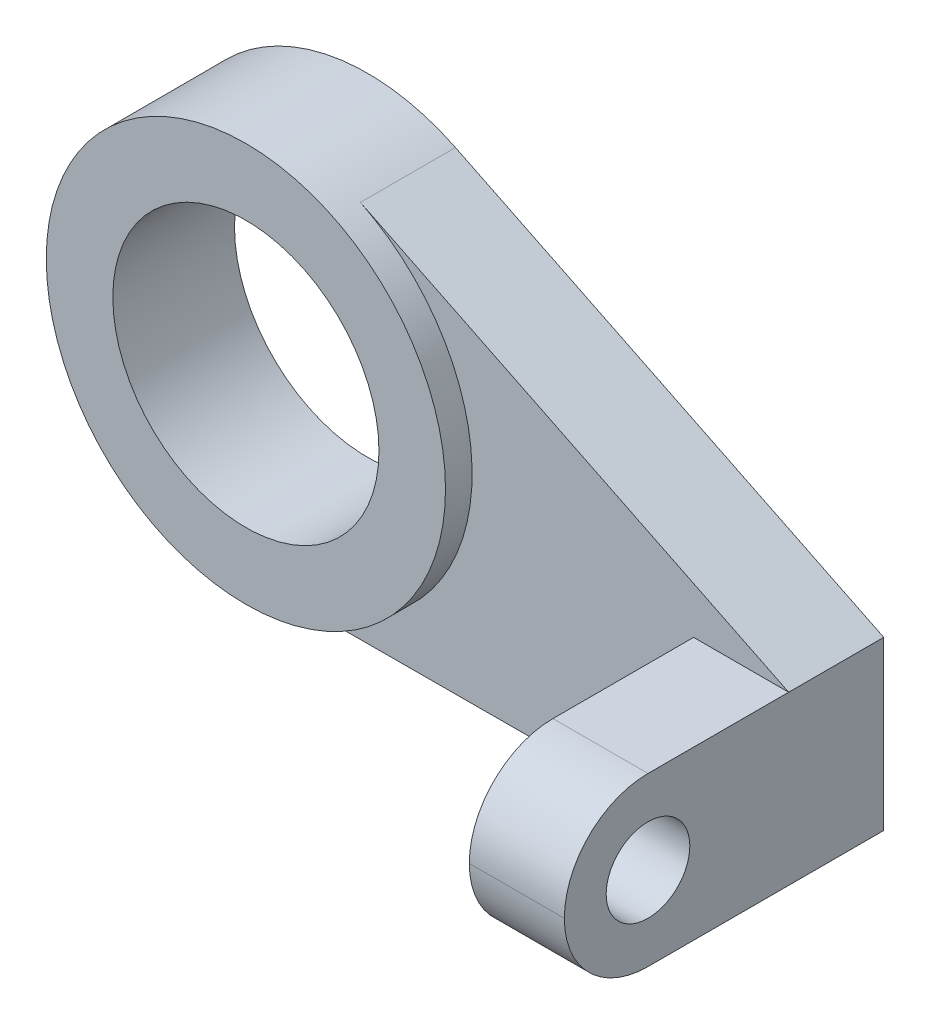
ISO-10303-21;
HEADER;
FILE_DESCRIPTION(('STEP AP214'),'2;1');
FILE_NAME('part.step','',(''),(''),'','','');
FILE_SCHEMA(('AUTOMOTIVE_DESIGN { 1 0 10303 214 1 1 1 1 }'));
ENDSEC;
DATA;
#1=APPLICATION_CONTEXT('core data for automotive mechanical design processes');
#2=APPLICATION_PROTOCOL_DEFINITION('international standard','automotive_design',2000,#1);
#3=PRODUCT_CONTEXT('',#1,'mechanical');
#4=PRODUCT('Part','Part','',(#3));
#5=PRODUCT_RELATED_PRODUCT_CATEGORY('part','',(#4));
#6=PRODUCT_DEFINITION_FORMATION('','',#4);
#7=PRODUCT_DEFINITION_CONTEXT('part definition',#1,'design');
#8=PRODUCT_DEFINITION('design','',#6,#7);
#9=PRODUCT_DEFINITION_SHAPE('','',#8);
#10=(LENGTH_UNIT() NAMED_UNIT(*) SI_UNIT(.MILLI.,.METRE.));
#11=(NAMED_UNIT(*) PLANE_ANGLE_UNIT() SI_UNIT($,.RADIAN.));
#12=(NAMED_UNIT(*) SI_UNIT($,.STERADIAN.) SOLID_ANGLE_UNIT());
#13=UNCERTAINTY_MEASURE_WITH_UNIT(LENGTH_MEASURE(1.E-05),#10,'distance_accuracy_value','');
#14=(GEOMETRIC_REPRESENTATION_CONTEXT(3) GLOBAL_UNCERTAINTY_ASSIGNED_CONTEXT((#13)) GLOBAL_UNIT_ASSIGNED_CONTEXT((#10,
#11,#12)) REPRESENTATION_CONTEXT('',''));
#15=CARTESIAN_POINT('',(0.,0.,0.));
#16=DIRECTION('',(0.,0.,1.));
#17=DIRECTION('',(1.,0.,0.));
#18=AXIS2_PLACEMENT_3D('',#15,#16,#17);
#19=CARTESIAN_POINT('',(0.,0.,25.));
#20=DIRECTION('',(0.,0.,-1.));
#21=DIRECTION('',(-1.,0.,0.));
#22=AXIS2_PLACEMENT_3D('',#19,#20,#21);
#23=PLANE('',#22);
#24=DIRECTION('',(-1.,0.,0.));
#25=VECTOR('',#24,1.);
#26=CARTESIAN_POINT('',(135.75897971073,-8.12087845522914,25.));
#27=LINE('',#26,#25);
#28=CARTESIAN_POINT('',(135.75897971073,-8.12087845522914,25.));
#29=VERTEX_POINT('',#28);
#30=CARTESIAN_POINT('',(110.75897971073,-8.12087845522914,25.));
#31=VERTEX_POINT('',#30);
#32=EDGE_CURVE('E142',#29,#31,#27,.T.);
#33=ORIENTED_EDGE('',*,*,#32,.F.);
#34=DIRECTION('',(0.897792250457663,-0.440419203734539,0.));
#35=VECTOR('',#34,1.);
#36=CARTESIAN_POINT('',(23.1220081960633,47.1340931490273,25.));
#37=LINE('',#36,#35);
#38=CARTESIAN_POINT('',(23.1220081960633,47.1340931490273,25.));
#39=VERTEX_POINT('',#38);
#40=EDGE_CURVE('E126',#39,#29,#37,.T.);
#41=ORIENTED_EDGE('',*,*,#40,.F.);
#42=CARTESIAN_POINT('',(0.,0.,25.));
#43=DIRECTION('',(0.,0.,-1.));
#44=DIRECTION('',(-1.,0.,0.));
#45=AXIS2_PLACEMENT_3D('',#42,#43,#44);
#46=CIRCLE('',#45,52.5);
#47=CARTESIAN_POINT('',(0.146690572739474,-52.4997950650845,25.));
#48=VERTEX_POINT('',#47);
#49=EDGE_CURVE('E122',#39,#48,#46,.T.);
#50=ORIENTED_EDGE('',*,*,#49,.T.);
#51=DIRECTION('',(-0.9999960964778,-0.00279410614741844,0.));
#52=VECTOR('',#51,1.);
#53=CARTESIAN_POINT('',(135.75897971073,-52.1208784552291,25.));
#54=LINE('',#53,#52);
#55=CARTESIAN_POINT('',(135.75897971073,-52.1208784552291,25.));
#56=VERTEX_POINT('',#55);
#57=EDGE_CURVE('E117',#56,#48,#54,.T.);
#58=ORIENTED_EDGE('',*,*,#57,.F.);
#59=DIRECTION('',(1.,0.,0.));
#60=VECTOR('',#59,1.);
#61=CARTESIAN_POINT('',(135.75897971073,-52.1208784552291,25.));
#62=LINE('',#61,#60);
#63=CARTESIAN_POINT('',(110.75897971073,-52.1208784552291,25.));
#64=VERTEX_POINT('',#63);
#65=EDGE_CURVE('E111',#64,#56,#62,.T.);
#66=ORIENTED_EDGE('',*,*,#65,.F.);
#67=DIRECTION('',(0.,-1.,0.));
#68=VECTOR('',#67,1.);
#69=CARTESIAN_POINT('',(110.75897971073,-52.1208784552291,25.));
#70=LINE('',#69,#68);
#71=EDGE_CURVE('E139',#31,#64,#70,.T.);
#72=ORIENTED_EDGE('',*,*,#71,.F.);
#73=EDGE_LOOP('',(#33,#41,#50,#58,#66,#72));
#74=FACE_BOUND('',#73,.T.);
#75=ADVANCED_FACE('F39',(#74),#23,.F.);
#76=CARTESIAN_POINT('',(0.,0.,32.));
#77=DIRECTION('',(0.,0.,-1.));
#78=DIRECTION('',(-1.,0.,0.));
#79=AXIS2_PLACEMENT_3D('',#76,#77,#78);
#80=CYLINDRICAL_SURFACE('',#79,52.5);
#81=CARTESIAN_POINT('',(0.,0.,32.));
#82=DIRECTION('',(0.,0.,1.));
#83=DIRECTION('',(1.,0.,0.));
#84=AXIS2_PLACEMENT_3D('',#81,#82,#83);
#85=CIRCLE('',#84,52.5);
#86=CARTESIAN_POINT('',(52.5,0.,32.));
#87=VERTEX_POINT('',#86);
#88=EDGE_CURVE('E185',#87,#87,#85,.T.);
#89=ORIENTED_EDGE('',*,*,#88,.F.);
#90=EDGE_LOOP('',(#89));
#91=FACE_BOUND('',#90,.T.);
#92=DIRECTION('',(0.,0.,-1.));
#93=VECTOR('',#92,1.);
#94=CARTESIAN_POINT('',(0.146690572739474,-52.4997950650845,25.));
#95=LINE('',#94,#93);
#96=CARTESIAN_POINT('',(0.146690572739474,-52.4997950650845,0.));
#97=VERTEX_POINT('',#96);
#98=EDGE_CURVE('E133',#48,#97,#95,.T.);
#99=ORIENTED_EDGE('',*,*,#98,.F.);
#100=ORIENTED_EDGE('',*,*,#49,.F.);
#101=DIRECTION('',(0.,0.,-1.));
#102=VECTOR('',#101,1.);
#103=CARTESIAN_POINT('',(23.1220081960633,47.1340931490273,25.));
#104=LINE('',#103,#102);
#105=CARTESIAN_POINT('',(23.1220081960633,47.1340931490273,0.));
#106=VERTEX_POINT('',#105);
#107=EDGE_CURVE('E160',#39,#106,#104,.T.);
#108=ORIENTED_EDGE('',*,*,#107,.T.);
#109=CARTESIAN_POINT('',(0.,0.,0.));
#110=DIRECTION('',(0.,0.,1.));
#111=DIRECTION('',(1.,0.,0.));
#112=AXIS2_PLACEMENT_3D('',#109,#110,#111);
#113=CIRCLE('',#112,52.5);
#114=EDGE_CURVE('E181',#106,#97,#113,.T.);
#115=ORIENTED_EDGE('',*,*,#114,.T.);
#116=EDGE_LOOP('',(#99,#100,#108,#115));
#117=FACE_BOUND('',#116,.T.);
#118=ADVANCED_FACE('F248',(#91,#117),#80,.T.);
#119=CARTESIAN_POINT('',(0.,0.,32.));
#120=DIRECTION('',(0.,0.,1.));
#121=DIRECTION('',(1.,0.,0.));
#122=AXIS2_PLACEMENT_3D('',#119,#120,#121);
#123=PLANE('',#122);
#124=ORIENTED_EDGE('',*,*,#88,.T.);
#125=EDGE_LOOP('',(#124));
#126=FACE_BOUND('',#125,.T.);
#127=CARTESIAN_POINT('',(0.,0.,32.));
#128=DIRECTION('',(0.,0.,1.));
#129=DIRECTION('',(1.,0.,0.));
#130=AXIS2_PLACEMENT_3D('',#127,#128,#129);
#131=CIRCLE('',#130,35.);
#132=CARTESIAN_POINT('',(35.,0.,32.));
#133=VERTEX_POINT('',#132);
#134=EDGE_CURVE('E177',#133,#133,#131,.T.);
#135=ORIENTED_EDGE('',*,*,#134,.F.);
#136=EDGE_LOOP('',(#135));
#137=FACE_BOUND('',#136,.T.);
#138=ADVANCED_FACE('F253',(#126,#137),#123,.T.);
#139=CARTESIAN_POINT('',(0.,0.,0.));
#140=DIRECTION('',(0.,0.,1.));
#141=DIRECTION('',(1.,0.,0.));
#142=AXIS2_PLACEMENT_3D('',#139,#140,#141);
#143=PLANE('',#142);
#144=ORIENTED_EDGE('',*,*,#114,.F.);
#145=DIRECTION('',(0.897792250457663,-0.440419203734539,0.));
#146=VECTOR('',#145,1.);
#147=CARTESIAN_POINT('',(23.1220081960633,47.1340931490273,0.));
#148=LINE('',#147,#146);
#149=CARTESIAN_POINT('',(135.75897971073,-8.12087845522914,0.));
#150=VERTEX_POINT('',#149);
#151=EDGE_CURVE('E155',#106,#150,#148,.T.);
#152=ORIENTED_EDGE('',*,*,#151,.T.);
#153=DIRECTION('',(0.,-1.,0.));
#154=VECTOR('',#153,1.);
#155=CARTESIAN_POINT('',(135.75897971073,-8.12087845522914,0.));
#156=LINE('',#155,#154);
#157=CARTESIAN_POINT('',(135.75897971073,-52.1208784552291,0.));
#158=VERTEX_POINT('',#157);
#159=EDGE_CURVE('E163',#150,#158,#156,.T.);
#160=ORIENTED_EDGE('',*,*,#159,.T.);
#161=DIRECTION('',(-0.9999960964778,-0.00279410614741844,0.));
#162=VECTOR('',#161,1.);
#163=CARTESIAN_POINT('',(135.75897971073,-52.1208784552291,0.));
#164=LINE('',#163,#162);
#165=EDGE_CURVE('E130',#158,#97,#164,.T.);
#166=ORIENTED_EDGE('',*,*,#165,.T.);
#167=EDGE_LOOP('',(#144,#152,#160,#166));
#168=FACE_BOUND('',#167,.T.);
#169=CARTESIAN_POINT('',(0.,0.,0.));
#170=DIRECTION('',(0.,0.,1.));
#171=DIRECTION('',(1.,0.,0.));
#172=AXIS2_PLACEMENT_3D('',#169,#170,#171);
#173=CIRCLE('',#172,35.);
#174=CARTESIAN_POINT('',(35.,0.,0.));
#175=VERTEX_POINT('',#174);
#176=EDGE_CURVE('E176',#175,#175,#173,.T.);
#177=ORIENTED_EDGE('',*,*,#176,.T.);
#178=EDGE_LOOP('',(#177));
#179=FACE_BOUND('',#178,.T.);
#180=ADVANCED_FACE('F267',(#168,#179),#143,.F.);
#181=CARTESIAN_POINT('',(0.,0.,32.));
#182=DIRECTION('',(0.,0.,-1.));
#183=DIRECTION('',(-1.,0.,0.));
#184=AXIS2_PLACEMENT_3D('',#181,#182,#183);
#185=CYLINDRICAL_SURFACE('',#184,35.);
#186=ORIENTED_EDGE('',*,*,#134,.T.);
#187=EDGE_LOOP('',(#186));
#188=FACE_BOUND('',#187,.T.);
#189=ORIENTED_EDGE('',*,*,#176,.F.);
#190=EDGE_LOOP('',(#189));
#191=FACE_BOUND('',#190,.T.);
#192=ADVANCED_FACE('F264',(#188,#191),#185,.F.);
#193=CARTESIAN_POINT('',(135.75897971073,-52.1208784552291,25.));
#194=DIRECTION('',(0.00279410614741844,-0.9999960964778,0.));
#195=DIRECTION('',(0.9999960964778,0.00279410614741844,0.));
#196=AXIS2_PLACEMENT_3D('',#193,#194,#195);
#197=PLANE('',#196);
#198=ORIENTED_EDGE('',*,*,#165,.F.);
#199=DIRECTION('',(0.,0.,-1.));
#200=VECTOR('',#199,1.);
#201=CARTESIAN_POINT('',(135.75897971073,-52.1208784552291,25.));
#202=LINE('',#201,#200);
#203=EDGE_CURVE('E104',#56,#158,#202,.T.);
#204=ORIENTED_EDGE('',*,*,#203,.F.);
#205=ORIENTED_EDGE('',*,*,#57,.T.);
#206=ORIENTED_EDGE('',*,*,#98,.T.);
#207=EDGE_LOOP('',(#198,#204,#205,#206));
#208=FACE_BOUND('',#207,.T.);
#209=ADVANCED_FACE('F128',(#208),#197,.T.);
#210=CARTESIAN_POINT('',(135.75897971073,-8.12087845522914,25.));
#211=DIRECTION('',(1.,0.,0.));
#212=DIRECTION('',(0.,0.,-1.));
#213=AXIS2_PLACEMENT_3D('',#210,#211,#212);
#214=PLANE('',#213);
#215=CARTESIAN_POINT('',(135.75897971073,-30.1208784552291,62.));
#216=DIRECTION('',(1.,0.,0.));
#217=DIRECTION('',(0.,0.,-1.));
#218=AXIS2_PLACEMENT_3D('',#215,#216,#217);
#219=CIRCLE('',#218,11.);
#220=CARTESIAN_POINT('',(135.75897971073,-30.1208784552291,51.));
#221=VERTEX_POINT('',#220);
#222=EDGE_CURVE('E219',#221,#221,#219,.T.);
#223=ORIENTED_EDGE('',*,*,#222,.F.);
#224=EDGE_LOOP('',(#223));
#225=FACE_BOUND('',#224,.T.);
#226=DIRECTION('',(0.,0.,-1.));
#227=VECTOR('',#226,1.);
#228=CARTESIAN_POINT('',(135.75897971073,-8.12087845522914,84.));
#229=LINE('',#228,#227);
#230=CARTESIAN_POINT('',(135.75897971073,-8.12087845522914,62.));
#231=VERTEX_POINT('',#230);
#232=EDGE_CURVE('E151',#231,#29,#229,.T.);
#233=ORIENTED_EDGE('',*,*,#232,.F.);
#234=CARTESIAN_POINT('',(135.75897971073,-30.1208784552291,62.));
#235=DIRECTION('',(1.,0.,0.));
#236=DIRECTION('',(0.,0.,-1.));
#237=AXIS2_PLACEMENT_3D('',#234,#235,#236);
#238=CIRCLE('',#237,22.);
#239=CARTESIAN_POINT('',(135.75897971073,-30.1208784552291,84.));
#240=VERTEX_POINT('',#239);
#241=EDGE_CURVE('E49',#231,#240,#238,.T.);
#242=ORIENTED_EDGE('',*,*,#241,.T.);
#243=CARTESIAN_POINT('',(135.75897971073,-30.1208784552291,62.));
#244=DIRECTION('',(1.,0.,0.));
#245=DIRECTION('',(0.,0.,-1.));
#246=AXIS2_PLACEMENT_3D('',#243,#244,#245);
#247=CIRCLE('',#246,22.);
#248=CARTESIAN_POINT('',(135.75897971073,-52.1208784552291,62.));
#249=VERTEX_POINT('',#248);
#250=EDGE_CURVE('E56',#240,#249,#247,.T.);
#251=ORIENTED_EDGE('',*,*,#250,.T.);
#252=DIRECTION('',(0.,0.,-1.));
#253=VECTOR('',#252,1.);
#254=CARTESIAN_POINT('',(135.75897971073,-52.1208784552291,84.));
#255=LINE('',#254,#253);
#256=EDGE_CURVE('E99',#249,#56,#255,.T.);
#257=ORIENTED_EDGE('',*,*,#256,.T.);
#258=ORIENTED_EDGE('',*,*,#203,.T.);
#259=ORIENTED_EDGE('',*,*,#159,.F.);
#260=DIRECTION('',(0.,0.,-1.));
#261=VECTOR('',#260,1.);
#262=CARTESIAN_POINT('',(135.75897971073,-8.12087845522914,25.));
#263=LINE('',#262,#261);
#264=EDGE_CURVE('E134',#29,#150,#263,.T.);
#265=ORIENTED_EDGE('',*,*,#264,.F.);
#266=EDGE_LOOP('',(#233,#242,#251,#257,#258,#259,#265));
#267=FACE_BOUND('',#266,.T.);
#268=ADVANCED_FACE('F101',(#225,#267),#214,.T.);
#269=CARTESIAN_POINT('',(23.1220081960633,47.1340931490273,25.));
#270=DIRECTION('',(0.440419203734539,0.897792250457663,0.));
#271=DIRECTION('',(-0.897792250457663,0.440419203734539,0.));
#272=AXIS2_PLACEMENT_3D('',#269,#270,#271);
#273=PLANE('',#272);
#274=ORIENTED_EDGE('',*,*,#151,.F.);
#275=ORIENTED_EDGE('',*,*,#107,.F.);
#276=ORIENTED_EDGE('',*,*,#40,.T.);
#277=ORIENTED_EDGE('',*,*,#264,.T.);
#278=EDGE_LOOP('',(#274,#275,#276,#277));
#279=FACE_BOUND('',#278,.T.);
#280=ADVANCED_FACE('F215',(#279),#273,.T.);
#281=CARTESIAN_POINT('',(135.75897971073,-8.12087845522914,84.));
#282=DIRECTION('',(0.,-1.,0.));
#283=DIRECTION('',(0.,0.,-1.));
#284=AXIS2_PLACEMENT_3D('',#281,#282,#283);
#285=PLANE('',#284);
#286=DIRECTION('',(0.,0.,-1.));
#287=VECTOR('',#286,1.);
#288=CARTESIAN_POINT('',(110.75897971073,-8.12087845522914,84.));
#289=LINE('',#288,#287);
#290=CARTESIAN_POINT('',(110.75897971073,-8.12087845522914,62.));
#291=VERTEX_POINT('',#290);
#292=EDGE_CURVE('E148',#291,#31,#289,.T.);
#293=ORIENTED_EDGE('',*,*,#292,.F.);
#294=DIRECTION('',(-1.,0.,0.));
#295=VECTOR('',#294,1.);
#296=CARTESIAN_POINT('',(135.75897971073,-8.12087845522914,62.));
#297=LINE('',#296,#295);
#298=EDGE_CURVE('E197',#291,#231,#297,.F.);
#299=ORIENTED_EDGE('',*,*,#298,.T.);
#300=ORIENTED_EDGE('',*,*,#232,.T.);
#301=ORIENTED_EDGE('',*,*,#32,.T.);
#302=EDGE_LOOP('',(#293,#299,#300,#301));
#303=FACE_BOUND('',#302,.T.);
#304=ADVANCED_FACE('F207',(#303),#285,.F.);
#305=CARTESIAN_POINT('',(110.75897971073,-52.1208784552291,84.));
#306=DIRECTION('',(1.,0.,0.));
#307=DIRECTION('',(0.,0.,-1.));
#308=AXIS2_PLACEMENT_3D('',#305,#306,#307);
#309=PLANE('',#308);
#310=CARTESIAN_POINT('',(110.75897971073,-30.1208784552291,62.));
#311=DIRECTION('',(-1.,0.,0.));
#312=DIRECTION('',(0.,0.,1.));
#313=AXIS2_PLACEMENT_3D('',#310,#311,#312);
#314=CIRCLE('',#313,11.);
#315=CARTESIAN_POINT('',(110.75897971073,-30.1208784552291,73.));
#316=VERTEX_POINT('',#315);
#317=EDGE_CURVE('E224',#316,#316,#314,.T.);
#318=ORIENTED_EDGE('',*,*,#317,.F.);
#319=EDGE_LOOP('',(#318));
#320=FACE_BOUND('',#319,.T.);
#321=CARTESIAN_POINT('',(110.75897971073,-30.1208784552291,62.));
#322=DIRECTION('',(1.,0.,0.));
#323=DIRECTION('',(0.,0.,-1.));
#324=AXIS2_PLACEMENT_3D('',#321,#322,#323);
#325=CIRCLE('',#324,22.);
#326=CARTESIAN_POINT('',(110.75897971073,-52.1208784552291,62.));
#327=VERTEX_POINT('',#326);
#328=CARTESIAN_POINT('',(110.75897971073,-30.1208784552291,84.));
#329=VERTEX_POINT('',#328);
#330=EDGE_CURVE('E189',#327,#329,#325,.F.);
#331=ORIENTED_EDGE('',*,*,#330,.T.);
#332=CARTESIAN_POINT('',(110.75897971073,-30.1208784552291,62.));
#333=DIRECTION('',(1.,0.,0.));
#334=DIRECTION('',(0.,0.,-1.));
#335=AXIS2_PLACEMENT_3D('',#332,#333,#334);
#336=CIRCLE('',#335,22.);
#337=EDGE_CURVE('E194',#329,#291,#336,.F.);
#338=ORIENTED_EDGE('',*,*,#337,.T.);
#339=ORIENTED_EDGE('',*,*,#292,.T.);
#340=ORIENTED_EDGE('',*,*,#71,.T.);
#341=DIRECTION('',(0.,0.,-1.));
#342=VECTOR('',#341,1.);
#343=CARTESIAN_POINT('',(110.75897971073,-52.1208784552291,84.));
#344=LINE('',#343,#342);
#345=EDGE_CURVE('E110',#327,#64,#344,.T.);
#346=ORIENTED_EDGE('',*,*,#345,.F.);
#347=EDGE_LOOP('',(#331,#338,#339,#340,#346));
#348=FACE_BOUND('',#347,.T.);
#349=ADVANCED_FACE('F231',(#320,#348),#309,.F.);
#350=CARTESIAN_POINT('',(135.75897971073,-52.1208784552291,84.));
#351=DIRECTION('',(0.,1.,0.));
#352=DIRECTION('',(0.,0.,1.));
#353=AXIS2_PLACEMENT_3D('',#350,#351,#352);
#354=PLANE('',#353);
#355=ORIENTED_EDGE('',*,*,#256,.F.);
#356=DIRECTION('',(1.,0.,0.));
#357=VECTOR('',#356,1.);
#358=CARTESIAN_POINT('',(110.75897971073,-52.1208784552291,62.));
#359=LINE('',#358,#357);
#360=EDGE_CURVE('E11',#249,#327,#359,.F.);
#361=ORIENTED_EDGE('',*,*,#360,.T.);
#362=ORIENTED_EDGE('',*,*,#345,.T.);
#363=ORIENTED_EDGE('',*,*,#65,.T.);
#364=EDGE_LOOP('',(#355,#361,#362,#363));
#365=FACE_BOUND('',#364,.T.);
#366=ADVANCED_FACE('F136',(#365),#354,.F.);
#367=CARTESIAN_POINT('',(0.,-30.1208784552291,62.));
#368=DIRECTION('',(-1.,0.,0.));
#369=DIRECTION('',(0.,0.,1.));
#370=AXIS2_PLACEMENT_3D('',#367,#368,#369);
#371=CYLINDRICAL_SURFACE('',#370,22.);
#372=ORIENTED_EDGE('',*,*,#360,.F.);
#373=ORIENTED_EDGE('',*,*,#250,.F.);
#374=DIRECTION('',(1.,0.,0.));
#375=VECTOR('',#374,1.);
#376=CARTESIAN_POINT('',(135.75897971073,-30.1208784552291,84.));
#377=LINE('',#376,#375);
#378=EDGE_CURVE('E43',#329,#240,#377,.T.);
#379=ORIENTED_EDGE('',*,*,#378,.F.);
#380=ORIENTED_EDGE('',*,*,#330,.F.);
#381=EDGE_LOOP('',(#372,#373,#379,#380));
#382=FACE_BOUND('',#381,.T.);
#383=ADVANCED_FACE('F41',(#382),#371,.T.);
#384=CARTESIAN_POINT('',(0.,-30.1208784552291,62.));
#385=DIRECTION('',(1.,0.,0.));
#386=DIRECTION('',(0.,0.,-1.));
#387=AXIS2_PLACEMENT_3D('',#384,#385,#386);
#388=CYLINDRICAL_SURFACE('',#387,22.);
#389=ORIENTED_EDGE('',*,*,#241,.F.);
#390=ORIENTED_EDGE('',*,*,#298,.F.);
#391=ORIENTED_EDGE('',*,*,#337,.F.);
#392=ORIENTED_EDGE('',*,*,#378,.T.);
#393=EDGE_LOOP('',(#389,#390,#391,#392));
#394=FACE_BOUND('',#393,.T.);
#395=ADVANCED_FACE('F238',(#394),#388,.T.);
#396=CARTESIAN_POINT('',(169.75897971073,-30.1208784552291,62.));
#397=DIRECTION('',(-1.,0.,0.));
#398=DIRECTION('',(0.,0.,1.));
#399=AXIS2_PLACEMENT_3D('',#396,#397,#398);
#400=CYLINDRICAL_SURFACE('',#399,11.);
#401=ORIENTED_EDGE('',*,*,#222,.T.);
#402=EDGE_LOOP('',(#401));
#403=FACE_BOUND('',#402,.T.);
#404=ORIENTED_EDGE('',*,*,#317,.T.);
#405=EDGE_LOOP('',(#404));
#406=FACE_BOUND('',#405,.T.);
#407=ADVANCED_FACE('F229',(#403,#406),#400,.F.);
#408=CLOSED_SHELL('',(#75,#118,#138,#180,#192,#209,#268,#280,#304,#349,#366,#383,#395,#407));
#409=MANIFOLD_SOLID_BREP('B2',#408);
#410=ADVANCED_BREP_SHAPE_REPRESENTATION('',(#18,#409),#14);
#411=SHAPE_DEFINITION_REPRESENTATION(#9,#410);
ENDSEC;
END-ISO-10303-21;
